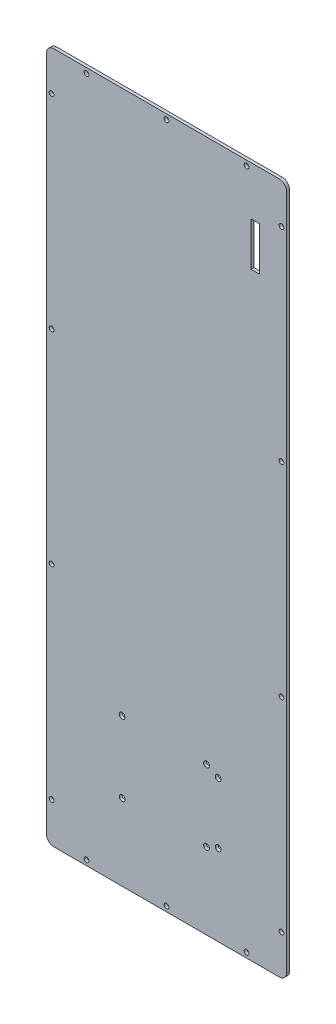
ISO-10303-21;
HEADER;
FILE_DESCRIPTION(('STEP AP214'),'2;1');
FILE_NAME('part.step','',(''),(''),'','','');
FILE_SCHEMA(('AUTOMOTIVE_DESIGN { 1 0 10303 214 1 1 1 1 }'));
ENDSEC;
DATA;
#1=APPLICATION_CONTEXT('core data for automotive mechanical design processes');
#2=APPLICATION_PROTOCOL_DEFINITION('international standard','automotive_design',2000,#1);
#3=PRODUCT_CONTEXT('',#1,'mechanical');
#4=PRODUCT('Part','Part','',(#3));
#5=PRODUCT_RELATED_PRODUCT_CATEGORY('part','',(#4));
#6=PRODUCT_DEFINITION_FORMATION('','',#4);
#7=PRODUCT_DEFINITION_CONTEXT('part definition',#1,'design');
#8=PRODUCT_DEFINITION('design','',#6,#7);
#9=PRODUCT_DEFINITION_SHAPE('','',#8);
#10=(LENGTH_UNIT() NAMED_UNIT(*) SI_UNIT(.MILLI.,.METRE.));
#11=(NAMED_UNIT(*) PLANE_ANGLE_UNIT() SI_UNIT($,.RADIAN.));
#12=(NAMED_UNIT(*) SI_UNIT($,.STERADIAN.) SOLID_ANGLE_UNIT());
#13=UNCERTAINTY_MEASURE_WITH_UNIT(LENGTH_MEASURE(1.E-05),#10,'distance_accuracy_value','');
#14=(GEOMETRIC_REPRESENTATION_CONTEXT(3) GLOBAL_UNCERTAINTY_ASSIGNED_CONTEXT((#13)) GLOBAL_UNIT_ASSIGNED_CONTEXT((#10,
#11,#12)) REPRESENTATION_CONTEXT('',''));
#15=CARTESIAN_POINT('',(0.,0.,0.));
#16=DIRECTION('',(0.,0.,1.));
#17=DIRECTION('',(1.,0.,0.));
#18=AXIS2_PLACEMENT_3D('',#15,#16,#17);
#19=CARTESIAN_POINT('',(0.,4.999999999999,0.));
#20=DIRECTION('',(-1.,0.,0.));
#21=DIRECTION('',(0.,0.,1.));
#22=AXIS2_PLACEMENT_3D('',#19,#20,#21);
#23=PLANE('',#22);
#24=DIRECTION('',(0.,0.,1.));
#25=VECTOR('',#24,1.);
#26=CARTESIAN_POINT('',(-1.E-11,5.000000000009,0.));
#27=LINE('',#26,#25);
#28=CARTESIAN_POINT('',(0.,4.999999999999,0.));
#29=VERTEX_POINT('',#28);
#30=CARTESIAN_POINT('',(0.,4.999999999999,2.03));
#31=VERTEX_POINT('',#30);
#32=EDGE_CURVE('E11',#29,#31,#27,.T.);
#33=ORIENTED_EDGE('',*,*,#32,.T.);
#34=DIRECTION('',(0.,1.,0.));
#35=VECTOR('',#34,1.);
#36=CARTESIAN_POINT('',(-1.E-11,5.000000000009,2.03000000001));
#37=LINE('',#36,#35);
#38=CARTESIAN_POINT('',(0.,469.99999999999,2.03));
#39=VERTEX_POINT('',#38);
#40=EDGE_CURVE('E28',#31,#39,#37,.T.);
#41=ORIENTED_EDGE('',*,*,#40,.T.);
#42=DIRECTION('',(0.,0.,1.));
#43=VECTOR('',#42,1.);
#44=CARTESIAN_POINT('',(0.,470.,0.));
#45=LINE('',#44,#43);
#46=CARTESIAN_POINT('',(0.,469.99999999999,0.));
#47=VERTEX_POINT('',#46);
#48=EDGE_CURVE('E392',#47,#39,#45,.T.);
#49=ORIENTED_EDGE('',*,*,#48,.F.);
#50=DIRECTION('',(0.,1.,0.));
#51=VECTOR('',#50,1.);
#52=CARTESIAN_POINT('',(-1.E-11,5.000000000009,0.));
#53=LINE('',#52,#51);
#54=EDGE_CURVE('E221',#29,#47,#53,.T.);
#55=ORIENTED_EDGE('',*,*,#54,.F.);
#56=EDGE_LOOP('',(#33,#41,#49,#55));
#57=FACE_BOUND('',#56,.T.);
#58=ADVANCED_FACE('F17',(#57),#23,.T.);
#59=CARTESIAN_POINT('',(5.,5.,0.));
#60=DIRECTION('',(0.,0.,-1.));
#61=DIRECTION('',(1.,0.,0.));
#62=AXIS2_PLACEMENT_3D('',#59,#60,#61);
#63=CYLINDRICAL_SURFACE('',#62,5.);
#64=CARTESIAN_POINT('',(5.00000000001,5.00000000001,0.));
#65=DIRECTION('',(0.,0.,1.));
#66=DIRECTION('',(1.,0.,0.));
#67=AXIS2_PLACEMENT_3D('',#64,#65,#66);
#68=CIRCLE('',#67,5.00000000001);
#69=CARTESIAN_POINT('',(5.000000000001,0.,0.));
#70=VERTEX_POINT('',#69);
#71=EDGE_CURVE('E301',#29,#70,#68,.T.);
#72=ORIENTED_EDGE('',*,*,#71,.T.);
#73=DIRECTION('',(0.,0.,1.));
#74=VECTOR('',#73,1.);
#75=CARTESIAN_POINT('',(5.000000000011,0.,0.));
#76=LINE('',#75,#74);
#77=CARTESIAN_POINT('',(5.000000000001,0.,2.03));
#78=VERTEX_POINT('',#77);
#79=EDGE_CURVE('E297',#70,#78,#76,.T.);
#80=ORIENTED_EDGE('',*,*,#79,.T.);
#81=CARTESIAN_POINT('',(5.00000000001,5.00000000001,2.03000000001));
#82=DIRECTION('',(0.,0.,1.));
#83=DIRECTION('',(1.,0.,0.));
#84=AXIS2_PLACEMENT_3D('',#81,#82,#83);
#85=CIRCLE('',#84,5.00000000001);
#86=EDGE_CURVE('E204',#31,#78,#85,.T.);
#87=ORIENTED_EDGE('',*,*,#86,.F.);
#88=ORIENTED_EDGE('',*,*,#32,.F.);
#89=EDGE_LOOP('',(#72,#80,#87,#88));
#90=FACE_BOUND('',#89,.T.);
#91=ADVANCED_FACE('F482',(#90),#63,.T.);
#92=CARTESIAN_POINT('',(5.,470.,0.));
#93=DIRECTION('',(0.,0.,-1.));
#94=DIRECTION('',(1.,0.,0.));
#95=AXIS2_PLACEMENT_3D('',#92,#93,#94);
#96=CYLINDRICAL_SURFACE('',#95,5.);
#97=CARTESIAN_POINT('',(5.00000000001,470.00000000001,0.));
#98=DIRECTION('',(0.,0.,1.));
#99=DIRECTION('',(1.,0.,0.));
#100=AXIS2_PLACEMENT_3D('',#97,#98,#99);
#101=CIRCLE('',#100,5.00000000001);
#102=CARTESIAN_POINT('',(4.999999999999,475.,0.));
#103=VERTEX_POINT('',#102);
#104=EDGE_CURVE('E302',#103,#47,#101,.T.);
#105=ORIENTED_EDGE('',*,*,#104,.T.);
#106=ORIENTED_EDGE('',*,*,#48,.T.);
#107=CARTESIAN_POINT('',(5.00000000001,470.00000000001,2.03000000001));
#108=DIRECTION('',(0.,0.,1.));
#109=DIRECTION('',(1.,0.,0.));
#110=AXIS2_PLACEMENT_3D('',#107,#108,#109);
#111=CIRCLE('',#110,5.00000000001);
#112=CARTESIAN_POINT('',(4.999999999999,475.,2.03));
#113=VERTEX_POINT('',#112);
#114=EDGE_CURVE('E144',#113,#39,#111,.T.);
#115=ORIENTED_EDGE('',*,*,#114,.F.);
#116=DIRECTION('',(0.,0.,1.));
#117=VECTOR('',#116,1.);
#118=CARTESIAN_POINT('',(5.000000000009,475.00000000001,0.));
#119=LINE('',#118,#117);
#120=EDGE_CURVE('E131',#103,#113,#119,.T.);
#121=ORIENTED_EDGE('',*,*,#120,.F.);
#122=EDGE_LOOP('',(#105,#106,#115,#121));
#123=FACE_BOUND('',#122,.T.);
#124=ADVANCED_FACE('F488',(#123),#96,.T.);
#125=CARTESIAN_POINT('',(0.,4.999999999999,0.));
#126=DIRECTION('',(0.,0.,1.));
#127=DIRECTION('',(1.,0.,0.));
#128=AXIS2_PLACEMENT_3D('',#125,#126,#127);
#129=PLANE('',#128);
#130=ORIENTED_EDGE('',*,*,#104,.F.);
#131=DIRECTION('',(1.,0.,0.));
#132=VECTOR('',#131,1.);
#133=CARTESIAN_POINT('',(5.000000000009,475.00000000001,0.));
#134=LINE('',#133,#132);
#135=CARTESIAN_POINT('',(159.99999999999,475.,0.));
#136=VERTEX_POINT('',#135);
#137=EDGE_CURVE('E180',#103,#136,#134,.T.);
#138=ORIENTED_EDGE('',*,*,#137,.T.);
#139=CARTESIAN_POINT('',(160.00000000001,470.00000000001,0.));
#140=DIRECTION('',(0.,0.,1.));
#141=DIRECTION('',(1.,0.,0.));
#142=AXIS2_PLACEMENT_3D('',#139,#140,#141);
#143=CIRCLE('',#142,5.00000000001);
#144=CARTESIAN_POINT('',(165.,470.,0.));
#145=VERTEX_POINT('',#144);
#146=EDGE_CURVE('E147',#145,#136,#143,.T.);
#147=ORIENTED_EDGE('',*,*,#146,.F.);
#148=DIRECTION('',(0.,-1.,0.));
#149=VECTOR('',#148,1.);
#150=CARTESIAN_POINT('',(165.00000000001,470.00000000001,0.));
#151=LINE('',#150,#149);
#152=CARTESIAN_POINT('',(165.,5.000000000001,0.));
#153=VERTEX_POINT('',#152);
#154=EDGE_CURVE('E176',#145,#153,#151,.T.);
#155=ORIENTED_EDGE('',*,*,#154,.T.);
#156=CARTESIAN_POINT('',(160.00000000001,5.00000000001,0.));
#157=DIRECTION('',(0.,0.,1.));
#158=DIRECTION('',(1.,0.,0.));
#159=AXIS2_PLACEMENT_3D('',#156,#157,#158);
#160=CIRCLE('',#159,5.00000000001);
#161=CARTESIAN_POINT('',(160.,0.,0.));
#162=VERTEX_POINT('',#161);
#163=EDGE_CURVE('E133',#162,#153,#160,.T.);
#164=ORIENTED_EDGE('',*,*,#163,.F.);
#165=DIRECTION('',(-1.,0.,0.));
#166=VECTOR('',#165,1.);
#167=CARTESIAN_POINT('',(160.00000000001,0.,0.));
#168=LINE('',#167,#166);
#169=EDGE_CURVE('E181',#162,#70,#168,.T.);
#170=ORIENTED_EDGE('',*,*,#169,.T.);
#171=ORIENTED_EDGE('',*,*,#71,.F.);
#172=ORIENTED_EDGE('',*,*,#54,.T.);
#173=EDGE_LOOP('',(#130,#138,#147,#155,#164,#170,#171,#172));
#174=FACE_BOUND('',#173,.T.);
#175=CARTESIAN_POINT('',(161.50000000001,27.50000000001,0.));
#176=DIRECTION('',(0.,0.,1.));
#177=DIRECTION('',(1.,0.,0.));
#178=AXIS2_PLACEMENT_3D('',#175,#176,#177);
#179=CIRCLE('',#178,1.65000000001);
#180=CARTESIAN_POINT('',(163.15000000002,27.50000000001,0.));
#181=VERTEX_POINT('',#180);
#182=EDGE_CURVE('E364',#181,#181,#179,.T.);
#183=ORIENTED_EDGE('',*,*,#182,.T.);
#184=EDGE_LOOP('',(#183));
#185=FACE_BOUND('',#184,.T.);
#186=CARTESIAN_POINT('',(161.50000000001,307.50000000001,0.));
#187=DIRECTION('',(0.,0.,1.));
#188=DIRECTION('',(1.,0.,0.));
#189=AXIS2_PLACEMENT_3D('',#186,#187,#188);
#190=CIRCLE('',#189,1.65000000001);
#191=CARTESIAN_POINT('',(163.15000000002,307.50000000001,0.));
#192=VERTEX_POINT('',#191);
#193=EDGE_CURVE('E368',#192,#192,#190,.T.);
#194=ORIENTED_EDGE('',*,*,#193,.T.);
#195=EDGE_LOOP('',(#194));
#196=FACE_BOUND('',#195,.T.);
#197=CARTESIAN_POINT('',(137.50000000001,3.50000000001,0.));
#198=DIRECTION('',(0.,0.,1.));
#199=DIRECTION('',(1.,0.,0.));
#200=AXIS2_PLACEMENT_3D('',#197,#198,#199);
#201=CIRCLE('',#200,1.65000000001);
#202=CARTESIAN_POINT('',(139.15000000002,3.50000000001,0.));
#203=VERTEX_POINT('',#202);
#204=EDGE_CURVE('E163',#203,#203,#201,.T.);
#205=ORIENTED_EDGE('',*,*,#204,.T.);
#206=EDGE_LOOP('',(#205));
#207=FACE_BOUND('',#206,.T.);
#208=CARTESIAN_POINT('',(27.50000000001,471.50000000001,0.));
#209=DIRECTION('',(0.,0.,1.));
#210=DIRECTION('',(1.,0.,0.));
#211=AXIS2_PLACEMENT_3D('',#208,#209,#210);
#212=CIRCLE('',#211,1.65000000001);
#213=CARTESIAN_POINT('',(29.15000000002,471.50000000001,0.));
#214=VERTEX_POINT('',#213);
#215=EDGE_CURVE('E208',#214,#214,#212,.T.);
#216=ORIENTED_EDGE('',*,*,#215,.T.);
#217=EDGE_LOOP('',(#216));
#218=FACE_BOUND('',#217,.T.);
#219=CARTESIAN_POINT('',(137.50000000001,471.50000000001,0.));
#220=DIRECTION('',(0.,0.,1.));
#221=DIRECTION('',(1.,0.,0.));
#222=AXIS2_PLACEMENT_3D('',#219,#220,#221);
#223=CIRCLE('',#222,1.65000000001);
#224=CARTESIAN_POINT('',(139.15000000002,471.50000000001,0.));
#225=VERTEX_POINT('',#224);
#226=EDGE_CURVE('E212',#225,#225,#223,.T.);
#227=ORIENTED_EDGE('',*,*,#226,.T.);
#228=EDGE_LOOP('',(#227));
#229=FACE_BOUND('',#228,.T.);
#230=CARTESIAN_POINT('',(82.50000000001,471.50000000001,0.));
#231=DIRECTION('',(0.,0.,1.));
#232=DIRECTION('',(1.,0.,0.));
#233=AXIS2_PLACEMENT_3D('',#230,#231,#232);
#234=CIRCLE('',#233,1.65000000001);
#235=CARTESIAN_POINT('',(84.15000000002,471.50000000001,0.));
#236=VERTEX_POINT('',#235);
#237=EDGE_CURVE('E247',#236,#236,#234,.T.);
#238=ORIENTED_EDGE('',*,*,#237,.T.);
#239=EDGE_LOOP('',(#238));
#240=FACE_BOUND('',#239,.T.);
#241=CARTESIAN_POINT('',(3.50000000001,27.50000000001,0.));
#242=DIRECTION('',(0.,0.,1.));
#243=DIRECTION('',(1.,0.,0.));
#244=AXIS2_PLACEMENT_3D('',#241,#242,#243);
#245=CIRCLE('',#244,1.65000000001);
#246=CARTESIAN_POINT('',(5.15000000002,27.50000000001,0.));
#247=VERTEX_POINT('',#246);
#248=EDGE_CURVE('E329',#247,#247,#245,.T.);
#249=ORIENTED_EDGE('',*,*,#248,.T.);
#250=EDGE_LOOP('',(#249));
#251=FACE_BOUND('',#250,.T.);
#252=CARTESIAN_POINT('',(3.50000000001,167.50000000001,0.));
#253=DIRECTION('',(0.,0.,1.));
#254=DIRECTION('',(1.,0.,0.));
#255=AXIS2_PLACEMENT_3D('',#252,#253,#254);
#256=CIRCLE('',#255,1.65000000001);
#257=CARTESIAN_POINT('',(5.15000000002,167.50000000001,0.));
#258=VERTEX_POINT('',#257);
#259=EDGE_CURVE('E344',#258,#258,#256,.T.);
#260=ORIENTED_EDGE('',*,*,#259,.T.);
#261=EDGE_LOOP('',(#260));
#262=FACE_BOUND('',#261,.T.);
#263=CARTESIAN_POINT('',(3.50000000001,447.50000000001,0.));
#264=DIRECTION('',(0.,0.,1.));
#265=DIRECTION('',(1.,0.,0.));
#266=AXIS2_PLACEMENT_3D('',#263,#264,#265);
#267=CIRCLE('',#266,1.65000000001);
#268=CARTESIAN_POINT('',(5.15000000002,447.50000000001,0.));
#269=VERTEX_POINT('',#268);
#270=EDGE_CURVE('E251',#269,#269,#267,.T.);
#271=ORIENTED_EDGE('',*,*,#270,.T.);
#272=EDGE_LOOP('',(#271));
#273=FACE_BOUND('',#272,.T.);
#274=CARTESIAN_POINT('',(3.50000000001,307.50000000001,0.));
#275=DIRECTION('',(0.,0.,1.));
#276=DIRECTION('',(1.,0.,0.));
#277=AXIS2_PLACEMENT_3D('',#274,#275,#276);
#278=CIRCLE('',#277,1.65000000001);
#279=CARTESIAN_POINT('',(5.15000000002,307.50000000001,0.));
#280=VERTEX_POINT('',#279);
#281=EDGE_CURVE('E233',#280,#280,#278,.T.);
#282=ORIENTED_EDGE('',*,*,#281,.T.);
#283=EDGE_LOOP('',(#282));
#284=FACE_BOUND('',#283,.T.);
#285=CARTESIAN_POINT('',(27.50000000001,3.50000000001,0.));
#286=DIRECTION('',(0.,0.,1.));
#287=DIRECTION('',(1.,0.,0.));
#288=AXIS2_PLACEMENT_3D('',#285,#286,#287);
#289=CIRCLE('',#288,1.65000000001);
#290=CARTESIAN_POINT('',(29.15000000002,3.50000000001,0.));
#291=VERTEX_POINT('',#290);
#292=EDGE_CURVE('E225',#291,#291,#289,.T.);
#293=ORIENTED_EDGE('',*,*,#292,.T.);
#294=EDGE_LOOP('',(#293));
#295=FACE_BOUND('',#294,.T.);
#296=CARTESIAN_POINT('',(82.50000000001,3.50000000001,0.));
#297=DIRECTION('',(0.,0.,1.));
#298=DIRECTION('',(1.,0.,0.));
#299=AXIS2_PLACEMENT_3D('',#296,#297,#298);
#300=CIRCLE('',#299,1.65000000001);
#301=CARTESIAN_POINT('',(84.15000000002,3.50000000001,0.));
#302=VERTEX_POINT('',#301);
#303=EDGE_CURVE('E222',#302,#302,#300,.T.);
#304=ORIENTED_EDGE('',*,*,#303,.T.);
#305=EDGE_LOOP('',(#304));
#306=FACE_BOUND('',#305,.T.);
#307=CARTESIAN_POINT('',(161.50000000001,167.50000000001,0.));
#308=DIRECTION('',(0.,0.,1.));
#309=DIRECTION('',(1.,0.,0.));
#310=AXIS2_PLACEMENT_3D('',#307,#308,#309);
#311=CIRCLE('',#310,1.65000000001);
#312=CARTESIAN_POINT('',(163.15000000002,167.50000000001,0.));
#313=VERTEX_POINT('',#312);
#314=EDGE_CURVE('E217',#313,#313,#311,.T.);
#315=ORIENTED_EDGE('',*,*,#314,.T.);
#316=EDGE_LOOP('',(#315));
#317=FACE_BOUND('',#316,.T.);
#318=CARTESIAN_POINT('',(161.50000000001,447.50000000001,0.));
#319=DIRECTION('',(0.,0.,1.));
#320=DIRECTION('',(1.,0.,0.));
#321=AXIS2_PLACEMENT_3D('',#318,#319,#320);
#322=CIRCLE('',#321,1.65000000001);
#323=CARTESIAN_POINT('',(163.15000000002,447.50000000001,0.));
#324=VERTEX_POINT('',#323);
#325=EDGE_CURVE('E213',#324,#324,#322,.T.);
#326=ORIENTED_EDGE('',*,*,#325,.T.);
#327=EDGE_LOOP('',(#326));
#328=FACE_BOUND('',#327,.T.);
#329=DIRECTION('',(1.,0.,0.));
#330=VECTOR('',#329,1.);
#331=CARTESIAN_POINT('',(70.25000000001,441.50000000001,0.));
#332=LINE('',#331,#330);
#333=CARTESIAN_POINT('',(140.5,441.5,0.));
#334=VERTEX_POINT('',#333);
#335=CARTESIAN_POINT('',(146.5,441.5,0.));
#336=VERTEX_POINT('',#335);
#337=EDGE_CURVE('E263',#334,#336,#332,.T.);
#338=ORIENTED_EDGE('',*,*,#337,.F.);
#339=DIRECTION('',(0.,1.,0.));
#340=VECTOR('',#339,1.);
#341=CARTESIAN_POINT('',(140.50000000001,208.25000000001,0.));
#342=LINE('',#341,#340);
#343=CARTESIAN_POINT('',(140.5,411.5,0.));
#344=VERTEX_POINT('',#343);
#345=EDGE_CURVE('E186',#344,#334,#342,.T.);
#346=ORIENTED_EDGE('',*,*,#345,.F.);
#347=DIRECTION('',(-1.,0.,0.));
#348=VECTOR('',#347,1.);
#349=CARTESIAN_POINT('',(73.25000000001,411.50000000001,0.));
#350=LINE('',#349,#348);
#351=CARTESIAN_POINT('',(146.5,411.5,0.));
#352=VERTEX_POINT('',#351);
#353=EDGE_CURVE('E292',#352,#344,#350,.T.);
#354=ORIENTED_EDGE('',*,*,#353,.F.);
#355=DIRECTION('',(0.,-1.,0.));
#356=VECTOR('',#355,1.);
#357=CARTESIAN_POINT('',(146.50000000001,223.25000000001,0.));
#358=LINE('',#357,#356);
#359=EDGE_CURVE('E277',#336,#352,#358,.T.);
#360=ORIENTED_EDGE('',*,*,#359,.F.);
#361=EDGE_LOOP('',(#338,#346,#354,#360));
#362=FACE_BOUND('',#361,.T.);
#363=CARTESIAN_POINT('',(52.00000000001,101.50000000001,0.));
#364=DIRECTION('',(0.,0.,1.));
#365=DIRECTION('',(1.,0.,0.));
#366=AXIS2_PLACEMENT_3D('',#363,#364,#365);
#367=CIRCLE('',#366,2.00000000001);
#368=CARTESIAN_POINT('',(54.00000000002,101.50000000001,0.));
#369=VERTEX_POINT('',#368);
#370=EDGE_CURVE('E218',#369,#369,#367,.T.);
#371=ORIENTED_EDGE('',*,*,#370,.T.);
#372=EDGE_LOOP('',(#371));
#373=FACE_BOUND('',#372,.T.);
#374=CARTESIAN_POINT('',(110.00000000001,101.50000000001,0.));
#375=DIRECTION('',(0.,0.,1.));
#376=DIRECTION('',(1.,0.,0.));
#377=AXIS2_PLACEMENT_3D('',#374,#375,#376);
#378=CIRCLE('',#377,2.00000000001);
#379=CARTESIAN_POINT('',(112.00000000002,101.50000000001,0.));
#380=VERTEX_POINT('',#379);
#381=EDGE_CURVE('E273',#380,#380,#378,.T.);
#382=ORIENTED_EDGE('',*,*,#381,.T.);
#383=EDGE_LOOP('',(#382));
#384=FACE_BOUND('',#383,.T.);
#385=CARTESIAN_POINT('',(118.00000000001,97.50000000001,0.));
#386=DIRECTION('',(0.,0.,1.));
#387=DIRECTION('',(1.,0.,0.));
#388=AXIS2_PLACEMENT_3D('',#385,#386,#387);
#389=CIRCLE('',#388,2.00000000001);
#390=CARTESIAN_POINT('',(120.00000000002,97.50000000001,0.));
#391=VERTEX_POINT('',#390);
#392=EDGE_CURVE('E269',#391,#391,#389,.T.);
#393=ORIENTED_EDGE('',*,*,#392,.T.);
#394=EDGE_LOOP('',(#393));
#395=FACE_BOUND('',#394,.T.);
#396=CARTESIAN_POINT('',(118.00000000001,55.67500000001,0.));
#397=DIRECTION('',(0.,0.,1.));
#398=DIRECTION('',(1.,0.,0.));
#399=AXIS2_PLACEMENT_3D('',#396,#397,#398);
#400=CIRCLE('',#399,2.00000000001);
#401=CARTESIAN_POINT('',(120.00000000002,55.67500000001,0.));
#402=VERTEX_POINT('',#401);
#403=EDGE_CURVE('E274',#402,#402,#400,.T.);
#404=ORIENTED_EDGE('',*,*,#403,.T.);
#405=EDGE_LOOP('',(#404));
#406=FACE_BOUND('',#405,.T.);
#407=CARTESIAN_POINT('',(52.00000000001,52.50000000001,0.));
#408=DIRECTION('',(0.,0.,1.));
#409=DIRECTION('',(1.,0.,0.));
#410=AXIS2_PLACEMENT_3D('',#407,#408,#409);
#411=CIRCLE('',#410,2.00000000001);
#412=CARTESIAN_POINT('',(54.00000000002,52.50000000001,0.));
#413=VERTEX_POINT('',#412);
#414=EDGE_CURVE('E282',#413,#413,#411,.T.);
#415=ORIENTED_EDGE('',*,*,#414,.T.);
#416=EDGE_LOOP('',(#415));
#417=FACE_BOUND('',#416,.T.);
#418=CARTESIAN_POINT('',(110.00000000001,52.50000000001,0.));
#419=DIRECTION('',(0.,0.,1.));
#420=DIRECTION('',(1.,0.,0.));
#421=AXIS2_PLACEMENT_3D('',#418,#419,#420);
#422=CIRCLE('',#421,2.00000000001);
#423=CARTESIAN_POINT('',(112.00000000002,52.50000000001,0.));
#424=VERTEX_POINT('',#423);
#425=EDGE_CURVE('E207',#424,#424,#422,.T.);
#426=ORIENTED_EDGE('',*,*,#425,.T.);
#427=EDGE_LOOP('',(#426));
#428=FACE_BOUND('',#427,.T.);
#429=ADVANCED_FACE('F444',(#174,#185,#196,#207,#218,#229,#240,#251,#262,#273,#284,#295,#306,
#317,#328,#362,#373,#384,#395,#406,#417,#428),#129,.F.);
#430=CARTESIAN_POINT('',(0.,4.999999999999,2.03));
#431=DIRECTION('',(0.,0.,1.));
#432=DIRECTION('',(1.,0.,0.));
#433=AXIS2_PLACEMENT_3D('',#430,#431,#432);
#434=PLANE('',#433);
#435=ORIENTED_EDGE('',*,*,#40,.F.);
#436=ORIENTED_EDGE('',*,*,#86,.T.);
#437=DIRECTION('',(-1.,0.,0.));
#438=VECTOR('',#437,1.);
#439=CARTESIAN_POINT('',(160.00000000001,0.,2.03000000001));
#440=LINE('',#439,#438);
#441=CARTESIAN_POINT('',(160.,0.,2.03));
#442=VERTEX_POINT('',#441);
#443=EDGE_CURVE('E306',#442,#78,#440,.T.);
#444=ORIENTED_EDGE('',*,*,#443,.F.);
#445=CARTESIAN_POINT('',(160.00000000001,5.00000000001,2.03000000001));
#446=DIRECTION('',(0.,0.,1.));
#447=DIRECTION('',(1.,0.,0.));
#448=AXIS2_PLACEMENT_3D('',#445,#446,#447);
#449=CIRCLE('',#448,5.00000000001);
#450=CARTESIAN_POINT('',(165.,5.000000000001,2.03));
#451=VERTEX_POINT('',#450);
#452=EDGE_CURVE('E143',#442,#451,#449,.T.);
#453=ORIENTED_EDGE('',*,*,#452,.T.);
#454=DIRECTION('',(0.,-1.,0.));
#455=VECTOR('',#454,1.);
#456=CARTESIAN_POINT('',(165.00000000001,470.00000000001,2.03000000001));
#457=LINE('',#456,#455);
#458=CARTESIAN_POINT('',(165.,470.,2.03));
#459=VERTEX_POINT('',#458);
#460=EDGE_CURVE('E139',#459,#451,#457,.T.);
#461=ORIENTED_EDGE('',*,*,#460,.F.);
#462=CARTESIAN_POINT('',(160.00000000001,470.00000000001,2.03000000001));
#463=DIRECTION('',(0.,0.,1.));
#464=DIRECTION('',(1.,0.,0.));
#465=AXIS2_PLACEMENT_3D('',#462,#463,#464);
#466=CIRCLE('',#465,5.00000000001);
#467=CARTESIAN_POINT('',(159.99999999999,475.,2.03));
#468=VERTEX_POINT('',#467);
#469=EDGE_CURVE('E21',#459,#468,#466,.T.);
#470=ORIENTED_EDGE('',*,*,#469,.T.);
#471=DIRECTION('',(1.,0.,0.));
#472=VECTOR('',#471,1.);
#473=CARTESIAN_POINT('',(5.000000000009,475.00000000001,2.03000000001));
#474=LINE('',#473,#472);
#475=EDGE_CURVE('E124',#113,#468,#474,.T.);
#476=ORIENTED_EDGE('',*,*,#475,.F.);
#477=ORIENTED_EDGE('',*,*,#114,.T.);
#478=EDGE_LOOP('',(#435,#436,#444,#453,#461,#470,#476,#477));
#479=FACE_BOUND('',#478,.T.);
#480=CARTESIAN_POINT('',(161.50000000001,27.50000000001,2.03000000001));
#481=DIRECTION('',(0.,0.,1.));
#482=DIRECTION('',(1.,0.,0.));
#483=AXIS2_PLACEMENT_3D('',#480,#481,#482);
#484=CIRCLE('',#483,1.65000000001);
#485=CARTESIAN_POINT('',(163.15000000002,27.50000000001,2.03000000001));
#486=VERTEX_POINT('',#485);
#487=EDGE_CURVE('E287',#486,#486,#484,.T.);
#488=ORIENTED_EDGE('',*,*,#487,.F.);
#489=EDGE_LOOP('',(#488));
#490=FACE_BOUND('',#489,.T.);
#491=CARTESIAN_POINT('',(137.50000000001,471.50000000001,2.03000000001));
#492=DIRECTION('',(0.,0.,1.));
#493=DIRECTION('',(1.,0.,0.));
#494=AXIS2_PLACEMENT_3D('',#491,#492,#493);
#495=CIRCLE('',#494,1.65000000001);
#496=CARTESIAN_POINT('',(139.15000000002,471.50000000001,2.03000000001));
#497=VERTEX_POINT('',#496);
#498=EDGE_CURVE('E257',#497,#497,#495,.T.);
#499=ORIENTED_EDGE('',*,*,#498,.F.);
#500=EDGE_LOOP('',(#499));
#501=FACE_BOUND('',#500,.T.);
#502=CARTESIAN_POINT('',(161.50000000001,307.50000000001,2.03000000001));
#503=DIRECTION('',(0.,0.,1.));
#504=DIRECTION('',(1.,0.,0.));
#505=AXIS2_PLACEMENT_3D('',#502,#503,#504);
#506=CIRCLE('',#505,1.65000000001);
#507=CARTESIAN_POINT('',(163.15000000002,307.50000000001,2.03000000001));
#508=VERTEX_POINT('',#507);
#509=EDGE_CURVE('E283',#508,#508,#506,.T.);
#510=ORIENTED_EDGE('',*,*,#509,.F.);
#511=EDGE_LOOP('',(#510));
#512=FACE_BOUND('',#511,.T.);
#513=CARTESIAN_POINT('',(137.50000000001,3.50000000001,2.03000000001));
#514=DIRECTION('',(0.,0.,1.));
#515=DIRECTION('',(1.,0.,0.));
#516=AXIS2_PLACEMENT_3D('',#513,#514,#515);
#517=CIRCLE('',#516,1.65000000001);
#518=CARTESIAN_POINT('',(139.15000000002,3.50000000001,2.03000000001));
#519=VERTEX_POINT('',#518);
#520=EDGE_CURVE('E256',#519,#519,#517,.T.);
#521=ORIENTED_EDGE('',*,*,#520,.F.);
#522=EDGE_LOOP('',(#521));
#523=FACE_BOUND('',#522,.T.);
#524=CARTESIAN_POINT('',(27.50000000001,3.50000000001,2.03000000001));
#525=DIRECTION('',(0.,0.,1.));
#526=DIRECTION('',(1.,0.,0.));
#527=AXIS2_PLACEMENT_3D('',#524,#525,#526);
#528=CIRCLE('',#527,1.65000000001);
#529=CARTESIAN_POINT('',(29.15000000002,3.50000000001,2.03000000001));
#530=VERTEX_POINT('',#529);
#531=EDGE_CURVE('E201',#530,#530,#528,.T.);
#532=ORIENTED_EDGE('',*,*,#531,.F.);
#533=EDGE_LOOP('',(#532));
#534=FACE_BOUND('',#533,.T.);
#535=CARTESIAN_POINT('',(82.50000000001,3.50000000001,2.03000000001));
#536=DIRECTION('',(0.,0.,1.));
#537=DIRECTION('',(1.,0.,0.));
#538=AXIS2_PLACEMENT_3D('',#535,#536,#537);
#539=CIRCLE('',#538,1.65000000001);
#540=CARTESIAN_POINT('',(84.15000000002,3.50000000001,2.03000000001));
#541=VERTEX_POINT('',#540);
#542=EDGE_CURVE('E314',#541,#541,#539,.T.);
#543=ORIENTED_EDGE('',*,*,#542,.F.);
#544=EDGE_LOOP('',(#543));
#545=FACE_BOUND('',#544,.T.);
#546=CARTESIAN_POINT('',(82.50000000001,471.50000000001,2.03000000001));
#547=DIRECTION('',(0.,0.,1.));
#548=DIRECTION('',(1.,0.,0.));
#549=AXIS2_PLACEMENT_3D('',#546,#547,#548);
#550=CIRCLE('',#549,1.65000000001);
#551=CARTESIAN_POINT('',(84.15000000002,471.50000000001,2.03000000001));
#552=VERTEX_POINT('',#551);
#553=EDGE_CURVE('E322',#552,#552,#550,.T.);
#554=ORIENTED_EDGE('',*,*,#553,.F.);
#555=EDGE_LOOP('',(#554));
#556=FACE_BOUND('',#555,.T.);
#557=CARTESIAN_POINT('',(27.50000000001,471.50000000001,2.03000000001));
#558=DIRECTION('',(0.,0.,1.));
#559=DIRECTION('',(1.,0.,0.));
#560=AXIS2_PLACEMENT_3D('',#557,#558,#559);
#561=CIRCLE('',#560,1.65000000001);
#562=CARTESIAN_POINT('',(29.15000000002,471.50000000001,2.03000000001));
#563=VERTEX_POINT('',#562);
#564=EDGE_CURVE('E252',#563,#563,#561,.T.);
#565=ORIENTED_EDGE('',*,*,#564,.F.);
#566=EDGE_LOOP('',(#565));
#567=FACE_BOUND('',#566,.T.);
#568=CARTESIAN_POINT('',(3.50000000001,27.50000000001,2.03000000001));
#569=DIRECTION('',(0.,0.,1.));
#570=DIRECTION('',(1.,0.,0.));
#571=AXIS2_PLACEMENT_3D('',#568,#569,#570);
#572=CIRCLE('',#571,1.65000000001);
#573=CARTESIAN_POINT('',(5.15000000002,27.50000000001,2.03000000001));
#574=VERTEX_POINT('',#573);
#575=EDGE_CURVE('E262',#574,#574,#572,.T.);
#576=ORIENTED_EDGE('',*,*,#575,.F.);
#577=EDGE_LOOP('',(#576));
#578=FACE_BOUND('',#577,.T.);
#579=CARTESIAN_POINT('',(3.50000000001,167.50000000001,2.03000000001));
#580=DIRECTION('',(0.,0.,1.));
#581=DIRECTION('',(1.,0.,0.));
#582=AXIS2_PLACEMENT_3D('',#579,#580,#581);
#583=CIRCLE('',#582,1.65000000001);
#584=CARTESIAN_POINT('',(5.15000000002,167.50000000001,2.03000000001));
#585=VERTEX_POINT('',#584);
#586=EDGE_CURVE('E258',#585,#585,#583,.T.);
#587=ORIENTED_EDGE('',*,*,#586,.F.);
#588=EDGE_LOOP('',(#587));
#589=FACE_BOUND('',#588,.T.);
#590=CARTESIAN_POINT('',(3.50000000001,447.50000000001,2.03000000001));
#591=DIRECTION('',(0.,0.,1.));
#592=DIRECTION('',(1.,0.,0.));
#593=AXIS2_PLACEMENT_3D('',#590,#591,#592);
#594=CIRCLE('',#593,1.65000000001);
#595=CARTESIAN_POINT('',(5.15000000002,447.50000000001,2.03000000001));
#596=VERTEX_POINT('',#595);
#597=EDGE_CURVE('E200',#596,#596,#594,.T.);
#598=ORIENTED_EDGE('',*,*,#597,.F.);
#599=EDGE_LOOP('',(#598));
#600=FACE_BOUND('',#599,.T.);
#601=CARTESIAN_POINT('',(3.50000000001,307.50000000001,2.03000000001));
#602=DIRECTION('',(0.,0.,1.));
#603=DIRECTION('',(1.,0.,0.));
#604=AXIS2_PLACEMENT_3D('',#601,#602,#603);
#605=CIRCLE('',#604,1.65000000001);
#606=CARTESIAN_POINT('',(5.15000000002,307.50000000001,2.03000000001));
#607=VERTEX_POINT('',#606);
#608=EDGE_CURVE('E196',#607,#607,#605,.T.);
#609=ORIENTED_EDGE('',*,*,#608,.F.);
#610=EDGE_LOOP('',(#609));
#611=FACE_BOUND('',#610,.T.);
#612=CARTESIAN_POINT('',(161.50000000001,167.50000000001,2.03000000001));
#613=DIRECTION('',(0.,0.,1.));
#614=DIRECTION('',(1.,0.,0.));
#615=AXIS2_PLACEMENT_3D('',#612,#613,#614);
#616=CIRCLE('',#615,1.65000000001);
#617=CARTESIAN_POINT('',(163.15000000002,167.50000000001,2.03000000001));
#618=VERTEX_POINT('',#617);
#619=EDGE_CURVE('E318',#618,#618,#616,.T.);
#620=ORIENTED_EDGE('',*,*,#619,.F.);
#621=EDGE_LOOP('',(#620));
#622=FACE_BOUND('',#621,.T.);
#623=CARTESIAN_POINT('',(161.50000000001,447.50000000001,2.03000000001));
#624=DIRECTION('',(0.,0.,1.));
#625=DIRECTION('',(1.,0.,0.));
#626=AXIS2_PLACEMENT_3D('',#623,#624,#625);
#627=CIRCLE('',#626,1.65000000001);
#628=CARTESIAN_POINT('',(163.15000000002,447.50000000001,2.03000000001));
#629=VERTEX_POINT('',#628);
#630=EDGE_CURVE('E340',#629,#629,#627,.T.);
#631=ORIENTED_EDGE('',*,*,#630,.F.);
#632=EDGE_LOOP('',(#631));
#633=FACE_BOUND('',#632,.T.);
#634=DIRECTION('',(1.,0.,0.));
#635=VECTOR('',#634,1.);
#636=CARTESIAN_POINT('',(140.50000000001,441.50000000001,2.03000000001));
#637=LINE('',#636,#635);
#638=CARTESIAN_POINT('',(140.5,441.5,2.03));
#639=VERTEX_POINT('',#638);
#640=CARTESIAN_POINT('',(146.5,441.5,2.03));
#641=VERTEX_POINT('',#640);
#642=EDGE_CURVE('E171',#639,#641,#637,.T.);
#643=ORIENTED_EDGE('',*,*,#642,.T.);
#644=DIRECTION('',(0.,-1.,0.));
#645=VECTOR('',#644,1.);
#646=CARTESIAN_POINT('',(146.50000000001,441.50000000001,2.03000000001));
#647=LINE('',#646,#645);
#648=CARTESIAN_POINT('',(146.5,411.5,2.03));
#649=VERTEX_POINT('',#648);
#650=EDGE_CURVE('E175',#641,#649,#647,.T.);
#651=ORIENTED_EDGE('',*,*,#650,.T.);
#652=DIRECTION('',(-1.,0.,0.));
#653=VECTOR('',#652,1.);
#654=CARTESIAN_POINT('',(146.50000000001,411.50000000001,2.03000000001));
#655=LINE('',#654,#653);
#656=CARTESIAN_POINT('',(140.5,411.5,2.03));
#657=VERTEX_POINT('',#656);
#658=EDGE_CURVE('E191',#649,#657,#655,.T.);
#659=ORIENTED_EDGE('',*,*,#658,.T.);
#660=DIRECTION('',(0.,1.,0.));
#661=VECTOR('',#660,1.);
#662=CARTESIAN_POINT('',(140.50000000001,411.50000000001,2.03000000001));
#663=LINE('',#662,#661);
#664=EDGE_CURVE('E296',#657,#639,#663,.T.);
#665=ORIENTED_EDGE('',*,*,#664,.T.);
#666=EDGE_LOOP('',(#643,#651,#659,#665));
#667=FACE_BOUND('',#666,.T.);
#668=CARTESIAN_POINT('',(110.00000000001,101.50000000001,2.03000000001));
#669=DIRECTION('',(0.,0.,1.));
#670=DIRECTION('',(1.,0.,0.));
#671=AXIS2_PLACEMENT_3D('',#668,#669,#670);
#672=CIRCLE('',#671,2.00000000001);
#673=CARTESIAN_POINT('',(112.00000000002,101.50000000001,2.03000000001));
#674=VERTEX_POINT('',#673);
#675=EDGE_CURVE('E187',#674,#674,#672,.T.);
#676=ORIENTED_EDGE('',*,*,#675,.F.);
#677=EDGE_LOOP('',(#676));
#678=FACE_BOUND('',#677,.T.);
#679=CARTESIAN_POINT('',(52.00000000001,101.50000000001,2.03000000001));
#680=DIRECTION('',(0.,0.,1.));
#681=DIRECTION('',(1.,0.,0.));
#682=AXIS2_PLACEMENT_3D('',#679,#680,#681);
#683=CIRCLE('',#682,2.00000000001);
#684=CARTESIAN_POINT('',(54.00000000002,101.50000000001,2.03000000001));
#685=VERTEX_POINT('',#684);
#686=EDGE_CURVE('E182',#685,#685,#683,.T.);
#687=ORIENTED_EDGE('',*,*,#686,.F.);
#688=EDGE_LOOP('',(#687));
#689=FACE_BOUND('',#688,.T.);
#690=CARTESIAN_POINT('',(118.00000000001,97.50000000001,2.03000000001));
#691=DIRECTION('',(0.,0.,1.));
#692=DIRECTION('',(1.,0.,0.));
#693=AXIS2_PLACEMENT_3D('',#690,#691,#692);
#694=CIRCLE('',#693,2.00000000001);
#695=CARTESIAN_POINT('',(120.00000000002,97.50000000001,2.03000000001));
#696=VERTEX_POINT('',#695);
#697=EDGE_CURVE('E169',#696,#696,#694,.T.);
#698=ORIENTED_EDGE('',*,*,#697,.F.);
#699=EDGE_LOOP('',(#698));
#700=FACE_BOUND('',#699,.T.);
#701=CARTESIAN_POINT('',(118.00000000001,55.67500000001,2.03000000001));
#702=DIRECTION('',(0.,0.,1.));
#703=DIRECTION('',(1.,0.,0.));
#704=AXIS2_PLACEMENT_3D('',#701,#702,#703);
#705=CIRCLE('',#704,2.00000000001);
#706=CARTESIAN_POINT('',(120.00000000002,55.67500000001,2.03000000001));
#707=VERTEX_POINT('',#706);
#708=EDGE_CURVE('E165',#707,#707,#705,.T.);
#709=ORIENTED_EDGE('',*,*,#708,.F.);
#710=EDGE_LOOP('',(#709));
#711=FACE_BOUND('',#710,.T.);
#712=CARTESIAN_POINT('',(52.00000000001,52.50000000001,2.03000000001));
#713=DIRECTION('',(0.,0.,1.));
#714=DIRECTION('',(1.,0.,0.));
#715=AXIS2_PLACEMENT_3D('',#712,#713,#714);
#716=CIRCLE('',#715,2.00000000001);
#717=CARTESIAN_POINT('',(54.00000000002,52.50000000001,2.03000000001));
#718=VERTEX_POINT('',#717);
#719=EDGE_CURVE('E170',#718,#718,#716,.T.);
#720=ORIENTED_EDGE('',*,*,#719,.F.);
#721=EDGE_LOOP('',(#720));
#722=FACE_BOUND('',#721,.T.);
#723=CARTESIAN_POINT('',(110.00000000001,52.50000000001,2.03000000001));
#724=DIRECTION('',(0.,0.,1.));
#725=DIRECTION('',(1.,0.,0.));
#726=AXIS2_PLACEMENT_3D('',#723,#724,#725);
#727=CIRCLE('',#726,2.00000000001);
#728=CARTESIAN_POINT('',(112.00000000002,52.50000000001,2.03000000001));
#729=VERTEX_POINT('',#728);
#730=EDGE_CURVE('E192',#729,#729,#727,.T.);
#731=ORIENTED_EDGE('',*,*,#730,.F.);
#732=EDGE_LOOP('',(#731));
#733=FACE_BOUND('',#732,.T.);
#734=ADVANCED_FACE('F136',(#479,#490,#501,#512,#523,#534,#545,#556,#567,#578,#589,#600,#611,
#622,#633,#667,#678,#689,#700,#711,#722,#733),#434,.T.);
#735=CARTESIAN_POINT('',(160.,0.,0.));
#736=DIRECTION('',(0.,-1.,0.));
#737=DIRECTION('',(0.,0.,-1.));
#738=AXIS2_PLACEMENT_3D('',#735,#736,#737);
#739=PLANE('',#738);
#740=DIRECTION('',(0.,0.,1.));
#741=VECTOR('',#740,1.);
#742=CARTESIAN_POINT('',(160.00000000001,0.,0.));
#743=LINE('',#742,#741);
#744=EDGE_CURVE('E303',#162,#442,#743,.T.);
#745=ORIENTED_EDGE('',*,*,#744,.T.);
#746=ORIENTED_EDGE('',*,*,#443,.T.);
#747=ORIENTED_EDGE('',*,*,#79,.F.);
#748=ORIENTED_EDGE('',*,*,#169,.F.);
#749=EDGE_LOOP('',(#745,#746,#747,#748));
#750=FACE_BOUND('',#749,.T.);
#751=ADVANCED_FACE('F456',(#750),#739,.T.);
#752=CARTESIAN_POINT('',(4.999999999999,475.,0.));
#753=DIRECTION('',(0.,1.,0.));
#754=DIRECTION('',(1.,0.,0.));
#755=AXIS2_PLACEMENT_3D('',#752,#753,#754);
#756=PLANE('',#755);
#757=ORIENTED_EDGE('',*,*,#120,.T.);
#758=ORIENTED_EDGE('',*,*,#475,.T.);
#759=DIRECTION('',(0.,0.,1.));
#760=VECTOR('',#759,1.);
#761=CARTESIAN_POINT('',(160.,475.00000000001,0.));
#762=LINE('',#761,#760);
#763=EDGE_CURVE('E129',#136,#468,#762,.T.);
#764=ORIENTED_EDGE('',*,*,#763,.F.);
#765=ORIENTED_EDGE('',*,*,#137,.F.);
#766=EDGE_LOOP('',(#757,#758,#764,#765));
#767=FACE_BOUND('',#766,.T.);
#768=ADVANCED_FACE('F126',(#767),#756,.T.);
#769=CARTESIAN_POINT('',(160.,5.,0.));
#770=DIRECTION('',(0.,0.,-1.));
#771=DIRECTION('',(1.,0.,0.));
#772=AXIS2_PLACEMENT_3D('',#769,#770,#771);
#773=CYLINDRICAL_SURFACE('',#772,5.);
#774=ORIENTED_EDGE('',*,*,#163,.T.);
#775=DIRECTION('',(0.,0.,1.));
#776=VECTOR('',#775,1.);
#777=CARTESIAN_POINT('',(165.00000000001,5.000000000011,0.));
#778=LINE('',#777,#776);
#779=EDGE_CURVE('E157',#153,#451,#778,.T.);
#780=ORIENTED_EDGE('',*,*,#779,.T.);
#781=ORIENTED_EDGE('',*,*,#452,.F.);
#782=ORIENTED_EDGE('',*,*,#744,.F.);
#783=EDGE_LOOP('',(#774,#780,#781,#782));
#784=FACE_BOUND('',#783,.T.);
#785=ADVANCED_FACE('F403',(#784),#773,.T.);
#786=CARTESIAN_POINT('',(160.,470.,0.));
#787=DIRECTION('',(0.,0.,-1.));
#788=DIRECTION('',(1.,0.,0.));
#789=AXIS2_PLACEMENT_3D('',#786,#787,#788);
#790=CYLINDRICAL_SURFACE('',#789,5.);
#791=ORIENTED_EDGE('',*,*,#146,.T.);
#792=ORIENTED_EDGE('',*,*,#763,.T.);
#793=ORIENTED_EDGE('',*,*,#469,.F.);
#794=DIRECTION('',(0.,0.,1.));
#795=VECTOR('',#794,1.);
#796=CARTESIAN_POINT('',(165.00000000001,470.00000000001,0.));
#797=LINE('',#796,#795);
#798=EDGE_CURVE('E150',#145,#459,#797,.T.);
#799=ORIENTED_EDGE('',*,*,#798,.F.);
#800=EDGE_LOOP('',(#791,#792,#793,#799));
#801=FACE_BOUND('',#800,.T.);
#802=ADVANCED_FACE('F145',(#801),#790,.T.);
#803=CARTESIAN_POINT('',(165.,470.,0.));
#804=DIRECTION('',(1.,0.,0.));
#805=DIRECTION('',(0.,1.,0.));
#806=AXIS2_PLACEMENT_3D('',#803,#804,#805);
#807=PLANE('',#806);
#808=ORIENTED_EDGE('',*,*,#798,.T.);
#809=ORIENTED_EDGE('',*,*,#460,.T.);
#810=ORIENTED_EDGE('',*,*,#779,.F.);
#811=ORIENTED_EDGE('',*,*,#154,.F.);
#812=EDGE_LOOP('',(#808,#809,#810,#811));
#813=FACE_BOUND('',#812,.T.);
#814=ADVANCED_FACE('F407',(#813),#807,.T.);
#815=CARTESIAN_POINT('',(161.5,27.5,2.03));
#816=DIRECTION('',(0.,0.,1.));
#817=DIRECTION('',(1.,0.,0.));
#818=AXIS2_PLACEMENT_3D('',#815,#816,#817);
#819=CYLINDRICAL_SURFACE('',#818,1.65);
#820=ORIENTED_EDGE('',*,*,#182,.F.);
#821=EDGE_LOOP('',(#820));
#822=FACE_BOUND('',#821,.T.);
#823=ORIENTED_EDGE('',*,*,#487,.T.);
#824=EDGE_LOOP('',(#823));
#825=FACE_BOUND('',#824,.T.);
#826=ADVANCED_FACE('F497',(#822,#825),#819,.F.);
#827=CARTESIAN_POINT('',(161.5,307.5,2.03));
#828=DIRECTION('',(0.,0.,1.));
#829=DIRECTION('',(1.,0.,0.));
#830=AXIS2_PLACEMENT_3D('',#827,#828,#829);
#831=CYLINDRICAL_SURFACE('',#830,1.65);
#832=ORIENTED_EDGE('',*,*,#193,.F.);
#833=EDGE_LOOP('',(#832));
#834=FACE_BOUND('',#833,.T.);
#835=ORIENTED_EDGE('',*,*,#509,.T.);
#836=EDGE_LOOP('',(#835));
#837=FACE_BOUND('',#836,.T.);
#838=ADVANCED_FACE('F493',(#834,#837),#831,.F.);
#839=CARTESIAN_POINT('',(137.5,3.5,2.03));
#840=DIRECTION('',(0.,0.,1.));
#841=DIRECTION('',(1.,0.,0.));
#842=AXIS2_PLACEMENT_3D('',#839,#840,#841);
#843=CYLINDRICAL_SURFACE('',#842,1.65);
#844=ORIENTED_EDGE('',*,*,#204,.F.);
#845=EDGE_LOOP('',(#844));
#846=FACE_BOUND('',#845,.T.);
#847=ORIENTED_EDGE('',*,*,#520,.T.);
#848=EDGE_LOOP('',(#847));
#849=FACE_BOUND('',#848,.T.);
#850=ADVANCED_FACE('F496',(#846,#849),#843,.F.);
#851=CARTESIAN_POINT('',(27.5,471.5,2.03));
#852=DIRECTION('',(0.,0.,1.));
#853=DIRECTION('',(1.,0.,0.));
#854=AXIS2_PLACEMENT_3D('',#851,#852,#853);
#855=CYLINDRICAL_SURFACE('',#854,1.65);
#856=ORIENTED_EDGE('',*,*,#215,.F.);
#857=EDGE_LOOP('',(#856));
#858=FACE_BOUND('',#857,.T.);
#859=ORIENTED_EDGE('',*,*,#564,.T.);
#860=EDGE_LOOP('',(#859));
#861=FACE_BOUND('',#860,.T.);
#862=ADVANCED_FACE('F502',(#858,#861),#855,.F.);
#863=CARTESIAN_POINT('',(137.5,471.5,2.03));
#864=DIRECTION('',(0.,0.,1.));
#865=DIRECTION('',(1.,0.,0.));
#866=AXIS2_PLACEMENT_3D('',#863,#864,#865);
#867=CYLINDRICAL_SURFACE('',#866,1.65);
#868=ORIENTED_EDGE('',*,*,#226,.F.);
#869=EDGE_LOOP('',(#868));
#870=FACE_BOUND('',#869,.T.);
#871=ORIENTED_EDGE('',*,*,#498,.T.);
#872=EDGE_LOOP('',(#871));
#873=FACE_BOUND('',#872,.T.);
#874=ADVANCED_FACE('F499',(#870,#873),#867,.F.);
#875=CARTESIAN_POINT('',(82.5,471.5,2.03));
#876=DIRECTION('',(0.,0.,1.));
#877=DIRECTION('',(1.,0.,0.));
#878=AXIS2_PLACEMENT_3D('',#875,#876,#877);
#879=CYLINDRICAL_SURFACE('',#878,1.65);
#880=ORIENTED_EDGE('',*,*,#237,.F.);
#881=EDGE_LOOP('',(#880));
#882=FACE_BOUND('',#881,.T.);
#883=ORIENTED_EDGE('',*,*,#553,.T.);
#884=EDGE_LOOP('',(#883));
#885=FACE_BOUND('',#884,.T.);
#886=ADVANCED_FACE('F501',(#882,#885),#879,.F.);
#887=CARTESIAN_POINT('',(3.5,27.5,2.03));
#888=DIRECTION('',(0.,0.,1.));
#889=DIRECTION('',(1.,0.,0.));
#890=AXIS2_PLACEMENT_3D('',#887,#888,#889);
#891=CYLINDRICAL_SURFACE('',#890,1.65);
#892=ORIENTED_EDGE('',*,*,#248,.F.);
#893=EDGE_LOOP('',(#892));
#894=FACE_BOUND('',#893,.T.);
#895=ORIENTED_EDGE('',*,*,#575,.T.);
#896=EDGE_LOOP('',(#895));
#897=FACE_BOUND('',#896,.T.);
#898=ADVANCED_FACE('F524',(#894,#897),#891,.F.);
#899=CARTESIAN_POINT('',(3.5,167.5,2.03));
#900=DIRECTION('',(0.,0.,1.));
#901=DIRECTION('',(1.,0.,0.));
#902=AXIS2_PLACEMENT_3D('',#899,#900,#901);
#903=CYLINDRICAL_SURFACE('',#902,1.65);
#904=ORIENTED_EDGE('',*,*,#259,.F.);
#905=EDGE_LOOP('',(#904));
#906=FACE_BOUND('',#905,.T.);
#907=ORIENTED_EDGE('',*,*,#586,.T.);
#908=EDGE_LOOP('',(#907));
#909=FACE_BOUND('',#908,.T.);
#910=ADVANCED_FACE('F574',(#906,#909),#903,.F.);
#911=CARTESIAN_POINT('',(3.5,447.5,2.03));
#912=DIRECTION('',(0.,0.,1.));
#913=DIRECTION('',(1.,0.,0.));
#914=AXIS2_PLACEMENT_3D('',#911,#912,#913);
#915=CYLINDRICAL_SURFACE('',#914,1.65);
#916=ORIENTED_EDGE('',*,*,#270,.F.);
#917=EDGE_LOOP('',(#916));
#918=FACE_BOUND('',#917,.T.);
#919=ORIENTED_EDGE('',*,*,#597,.T.);
#920=EDGE_LOOP('',(#919));
#921=FACE_BOUND('',#920,.T.);
#922=ADVANCED_FACE('F515',(#918,#921),#915,.F.);
#923=CARTESIAN_POINT('',(3.5,307.5,2.03));
#924=DIRECTION('',(0.,0.,1.));
#925=DIRECTION('',(1.,0.,0.));
#926=AXIS2_PLACEMENT_3D('',#923,#924,#925);
#927=CYLINDRICAL_SURFACE('',#926,1.65);
#928=ORIENTED_EDGE('',*,*,#281,.F.);
#929=EDGE_LOOP('',(#928));
#930=FACE_BOUND('',#929,.T.);
#931=ORIENTED_EDGE('',*,*,#608,.T.);
#932=EDGE_LOOP('',(#931));
#933=FACE_BOUND('',#932,.T.);
#934=ADVANCED_FACE('F566',(#930,#933),#927,.F.);
#935=CARTESIAN_POINT('',(27.5,3.5,2.03));
#936=DIRECTION('',(0.,0.,1.));
#937=DIRECTION('',(1.,0.,0.));
#938=AXIS2_PLACEMENT_3D('',#935,#936,#937);
#939=CYLINDRICAL_SURFACE('',#938,1.65);
#940=ORIENTED_EDGE('',*,*,#292,.F.);
#941=EDGE_LOOP('',(#940));
#942=FACE_BOUND('',#941,.T.);
#943=ORIENTED_EDGE('',*,*,#531,.T.);
#944=EDGE_LOOP('',(#943));
#945=FACE_BOUND('',#944,.T.);
#946=ADVANCED_FACE('F568',(#942,#945),#939,.F.);
#947=CARTESIAN_POINT('',(82.5,3.5,2.03));
#948=DIRECTION('',(0.,0.,1.));
#949=DIRECTION('',(1.,0.,0.));
#950=AXIS2_PLACEMENT_3D('',#947,#948,#949);
#951=CYLINDRICAL_SURFACE('',#950,1.65);
#952=ORIENTED_EDGE('',*,*,#303,.F.);
#953=EDGE_LOOP('',(#952));
#954=FACE_BOUND('',#953,.T.);
#955=ORIENTED_EDGE('',*,*,#542,.T.);
#956=EDGE_LOOP('',(#955));
#957=FACE_BOUND('',#956,.T.);
#958=ADVANCED_FACE('F561',(#954,#957),#951,.F.);
#959=CARTESIAN_POINT('',(161.5,167.5,2.03));
#960=DIRECTION('',(0.,0.,1.));
#961=DIRECTION('',(1.,0.,0.));
#962=AXIS2_PLACEMENT_3D('',#959,#960,#961);
#963=CYLINDRICAL_SURFACE('',#962,1.65);
#964=ORIENTED_EDGE('',*,*,#314,.F.);
#965=EDGE_LOOP('',(#964));
#966=FACE_BOUND('',#965,.T.);
#967=ORIENTED_EDGE('',*,*,#619,.T.);
#968=EDGE_LOOP('',(#967));
#969=FACE_BOUND('',#968,.T.);
#970=ADVANCED_FACE('F558',(#966,#969),#963,.F.);
#971=CARTESIAN_POINT('',(161.5,447.5,2.03));
#972=DIRECTION('',(0.,0.,1.));
#973=DIRECTION('',(1.,0.,0.));
#974=AXIS2_PLACEMENT_3D('',#971,#972,#973);
#975=CYLINDRICAL_SURFACE('',#974,1.65);
#976=ORIENTED_EDGE('',*,*,#325,.F.);
#977=EDGE_LOOP('',(#976));
#978=FACE_BOUND('',#977,.T.);
#979=ORIENTED_EDGE('',*,*,#630,.T.);
#980=EDGE_LOOP('',(#979));
#981=FACE_BOUND('',#980,.T.);
#982=ADVANCED_FACE('F529',(#978,#981),#975,.F.);
#983=CARTESIAN_POINT('',(146.5,441.5,2.03));
#984=DIRECTION('',(-1.,0.,0.));
#985=DIRECTION('',(0.,0.,1.));
#986=AXIS2_PLACEMENT_3D('',#983,#984,#985);
#987=PLANE('',#986);
#988=ORIENTED_EDGE('',*,*,#650,.F.);
#989=DIRECTION('',(0.,0.,-1.));
#990=VECTOR('',#989,1.);
#991=CARTESIAN_POINT('',(146.50000000001,441.50000000001,2.03000000001));
#992=LINE('',#991,#990);
#993=EDGE_CURVE('E336',#641,#336,#992,.T.);
#994=ORIENTED_EDGE('',*,*,#993,.T.);
#995=ORIENTED_EDGE('',*,*,#359,.T.);
#996=DIRECTION('',(0.,0.,-1.));
#997=VECTOR('',#996,1.);
#998=CARTESIAN_POINT('',(146.50000000001,411.50000000001,2.03000000001));
#999=LINE('',#998,#997);
#1000=EDGE_CURVE('E268',#649,#352,#999,.T.);
#1001=ORIENTED_EDGE('',*,*,#1000,.F.);
#1002=EDGE_LOOP('',(#988,#994,#995,#1001));
#1003=FACE_BOUND('',#1002,.T.);
#1004=ADVANCED_FACE('F526',(#1003),#987,.T.);
#1005=CARTESIAN_POINT('',(140.5,441.5,2.03));
#1006=DIRECTION('',(0.,-1.,0.));
#1007=DIRECTION('',(0.,0.,-1.));
#1008=AXIS2_PLACEMENT_3D('',#1005,#1006,#1007);
#1009=PLANE('',#1008);
#1010=ORIENTED_EDGE('',*,*,#642,.F.);
#1011=DIRECTION('',(0.,0.,-1.));
#1012=VECTOR('',#1011,1.);
#1013=CARTESIAN_POINT('',(140.50000000001,441.50000000001,2.03000000001));
#1014=LINE('',#1013,#1012);
#1015=EDGE_CURVE('E267',#639,#334,#1014,.T.);
#1016=ORIENTED_EDGE('',*,*,#1015,.T.);
#1017=ORIENTED_EDGE('',*,*,#337,.T.);
#1018=ORIENTED_EDGE('',*,*,#993,.F.);
#1019=EDGE_LOOP('',(#1010,#1016,#1017,#1018));
#1020=FACE_BOUND('',#1019,.T.);
#1021=ADVANCED_FACE('F528',(#1020),#1009,.T.);
#1022=CARTESIAN_POINT('',(146.5,411.5,2.03));
#1023=DIRECTION('',(0.,1.,0.));
#1024=DIRECTION('',(1.,0.,0.));
#1025=AXIS2_PLACEMENT_3D('',#1022,#1023,#1024);
#1026=PLANE('',#1025);
#1027=ORIENTED_EDGE('',*,*,#658,.F.);
#1028=ORIENTED_EDGE('',*,*,#1000,.T.);
#1029=ORIENTED_EDGE('',*,*,#353,.T.);
#1030=DIRECTION('',(0.,0.,-1.));
#1031=VECTOR('',#1030,1.);
#1032=CARTESIAN_POINT('',(140.50000000001,411.50000000001,2.03000000001));
#1033=LINE('',#1032,#1031);
#1034=EDGE_CURVE('E288',#657,#344,#1033,.T.);
#1035=ORIENTED_EDGE('',*,*,#1034,.F.);
#1036=EDGE_LOOP('',(#1027,#1028,#1029,#1035));
#1037=FACE_BOUND('',#1036,.T.);
#1038=ADVANCED_FACE('F571',(#1037),#1026,.T.);
#1039=CARTESIAN_POINT('',(140.5,411.5,2.03));
#1040=DIRECTION('',(1.,0.,0.));
#1041=DIRECTION('',(0.,1.,0.));
#1042=AXIS2_PLACEMENT_3D('',#1039,#1040,#1041);
#1043=PLANE('',#1042);
#1044=ORIENTED_EDGE('',*,*,#664,.F.);
#1045=ORIENTED_EDGE('',*,*,#1034,.T.);
#1046=ORIENTED_EDGE('',*,*,#345,.T.);
#1047=ORIENTED_EDGE('',*,*,#1015,.F.);
#1048=EDGE_LOOP('',(#1044,#1045,#1046,#1047));
#1049=FACE_BOUND('',#1048,.T.);
#1050=ADVANCED_FACE('F556',(#1049),#1043,.T.);
#1051=CARTESIAN_POINT('',(52.,101.5,2.03));
#1052=DIRECTION('',(0.,0.,1.));
#1053=DIRECTION('',(1.,0.,0.));
#1054=AXIS2_PLACEMENT_3D('',#1051,#1052,#1053);
#1055=CYLINDRICAL_SURFACE('',#1054,2.);
#1056=ORIENTED_EDGE('',*,*,#370,.F.);
#1057=EDGE_LOOP('',(#1056));
#1058=FACE_BOUND('',#1057,.T.);
#1059=ORIENTED_EDGE('',*,*,#686,.T.);
#1060=EDGE_LOOP('',(#1059));
#1061=FACE_BOUND('',#1060,.T.);
#1062=ADVANCED_FACE('F450',(#1058,#1061),#1055,.F.);
#1063=CARTESIAN_POINT('',(110.,101.5,2.03));
#1064=DIRECTION('',(0.,0.,1.));
#1065=DIRECTION('',(1.,0.,0.));
#1066=AXIS2_PLACEMENT_3D('',#1063,#1064,#1065);
#1067=CYLINDRICAL_SURFACE('',#1066,2.);
#1068=ORIENTED_EDGE('',*,*,#381,.F.);
#1069=EDGE_LOOP('',(#1068));
#1070=FACE_BOUND('',#1069,.T.);
#1071=ORIENTED_EDGE('',*,*,#675,.T.);
#1072=EDGE_LOOP('',(#1071));
#1073=FACE_BOUND('',#1072,.T.);
#1074=ADVANCED_FACE('F447',(#1070,#1073),#1067,.F.);
#1075=CARTESIAN_POINT('',(118.,97.5,2.03));
#1076=DIRECTION('',(0.,0.,1.));
#1077=DIRECTION('',(1.,0.,0.));
#1078=AXIS2_PLACEMENT_3D('',#1075,#1076,#1077);
#1079=CYLINDRICAL_SURFACE('',#1078,2.);
#1080=ORIENTED_EDGE('',*,*,#392,.F.);
#1081=EDGE_LOOP('',(#1080));
#1082=FACE_BOUND('',#1081,.T.);
#1083=ORIENTED_EDGE('',*,*,#697,.T.);
#1084=EDGE_LOOP('',(#1083));
#1085=FACE_BOUND('',#1084,.T.);
#1086=ADVANCED_FACE('F19',(#1082,#1085),#1079,.F.);
#1087=CARTESIAN_POINT('',(118.,55.675,2.03));
#1088=DIRECTION('',(0.,0.,1.));
#1089=DIRECTION('',(1.,0.,0.));
#1090=AXIS2_PLACEMENT_3D('',#1087,#1088,#1089);
#1091=CYLINDRICAL_SURFACE('',#1090,2.);
#1092=ORIENTED_EDGE('',*,*,#403,.F.);
#1093=EDGE_LOOP('',(#1092));
#1094=FACE_BOUND('',#1093,.T.);
#1095=ORIENTED_EDGE('',*,*,#708,.T.);
#1096=EDGE_LOOP('',(#1095));
#1097=FACE_BOUND('',#1096,.T.);
#1098=ADVANCED_FACE('F477',(#1094,#1097),#1091,.F.);
#1099=CARTESIAN_POINT('',(52.,52.5,2.03));
#1100=DIRECTION('',(0.,0.,1.));
#1101=DIRECTION('',(1.,0.,0.));
#1102=AXIS2_PLACEMENT_3D('',#1099,#1100,#1101);
#1103=CYLINDRICAL_SURFACE('',#1102,2.);
#1104=ORIENTED_EDGE('',*,*,#414,.F.);
#1105=EDGE_LOOP('',(#1104));
#1106=FACE_BOUND('',#1105,.T.);
#1107=ORIENTED_EDGE('',*,*,#719,.T.);
#1108=EDGE_LOOP('',(#1107));
#1109=FACE_BOUND('',#1108,.T.);
#1110=ADVANCED_FACE('F470',(#1106,#1109),#1103,.F.);
#1111=CARTESIAN_POINT('',(110.,52.5,2.03));
#1112=DIRECTION('',(0.,0.,1.));
#1113=DIRECTION('',(1.,0.,0.));
#1114=AXIS2_PLACEMENT_3D('',#1111,#1112,#1113);
#1115=CYLINDRICAL_SURFACE('',#1114,2.);
#1116=ORIENTED_EDGE('',*,*,#425,.F.);
#1117=EDGE_LOOP('',(#1116));
#1118=FACE_BOUND('',#1117,.T.);
#1119=ORIENTED_EDGE('',*,*,#730,.T.);
#1120=EDGE_LOOP('',(#1119));
#1121=FACE_BOUND('',#1120,.T.);
#1122=ADVANCED_FACE('F468',(#1118,#1121),#1115,.F.);
#1123=CLOSED_SHELL('',(#58,#91,#124,#429,#734,#751,#768,#785,#802,#814,#826,#838,#850,#862,#874,
#886,#898,#910,#922,#934,#946,#958,#970,#982,#1004,#1021,#1038,#1050,#1062,#1074,#1086,#1098,
#1110,#1122));
#1124=MANIFOLD_SOLID_BREP('B1',#1123);
#1125=ADVANCED_BREP_SHAPE_REPRESENTATION('',(#18,#1124),#14);
#1126=SHAPE_DEFINITION_REPRESENTATION(#9,#1125);
ENDSEC;
END-ISO-10303-21;
